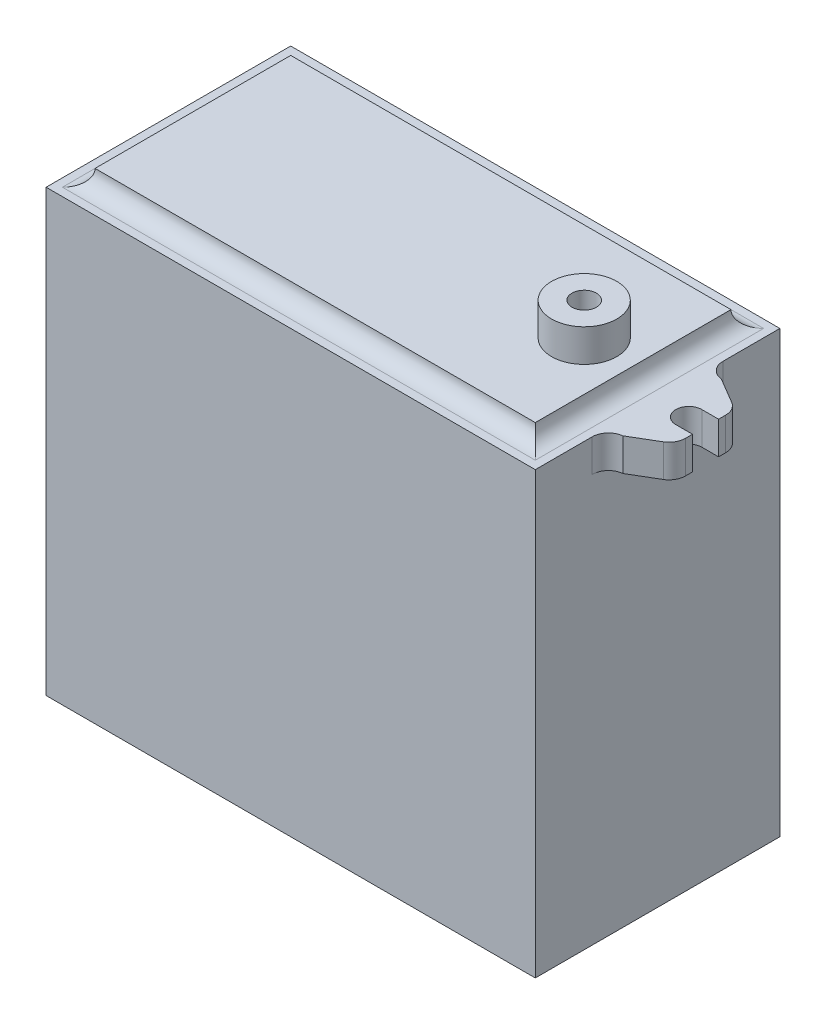
ISO-10303-21;
HEADER;
FILE_DESCRIPTION(('STEP AP214'),'2;1');
FILE_NAME('part.step','',(''),(''),'','','');
FILE_SCHEMA(('AUTOMOTIVE_DESIGN { 1 0 10303 214 1 1 1 1 }'));
ENDSEC;
DATA;
#1=APPLICATION_CONTEXT('core data for automotive mechanical design processes');
#2=APPLICATION_PROTOCOL_DEFINITION('international standard','automotive_design',2000,#1);
#3=PRODUCT_CONTEXT('',#1,'mechanical');
#4=PRODUCT('Part','Part','',(#3));
#5=PRODUCT_RELATED_PRODUCT_CATEGORY('part','',(#4));
#6=PRODUCT_DEFINITION_FORMATION('','',#4);
#7=PRODUCT_DEFINITION_CONTEXT('part definition',#1,'design');
#8=PRODUCT_DEFINITION('design','',#6,#7);
#9=PRODUCT_DEFINITION_SHAPE('','',#8);
#10=(LENGTH_UNIT() NAMED_UNIT(*) SI_UNIT(.MILLI.,.METRE.));
#11=(NAMED_UNIT(*) PLANE_ANGLE_UNIT() SI_UNIT($,.RADIAN.));
#12=(NAMED_UNIT(*) SI_UNIT($,.STERADIAN.) SOLID_ANGLE_UNIT());
#13=UNCERTAINTY_MEASURE_WITH_UNIT(LENGTH_MEASURE(1.E-05),#10,'distance_accuracy_value','');
#14=(GEOMETRIC_REPRESENTATION_CONTEXT(3) GLOBAL_UNCERTAINTY_ASSIGNED_CONTEXT((#13)) GLOBAL_UNIT_ASSIGNED_CONTEXT((#10,
#11,#12)) REPRESENTATION_CONTEXT('',''));
#15=CARTESIAN_POINT('',(0.,0.,0.));
#16=DIRECTION('',(0.,0.,1.));
#17=DIRECTION('',(1.,0.,0.));
#18=AXIS2_PLACEMENT_3D('',#15,#16,#17);
#19=CARTESIAN_POINT('',(15.,27.,-7.5));
#20=DIRECTION('',(-1.,0.,0.));
#21=DIRECTION('',(0.,0.,1.));
#22=AXIS2_PLACEMENT_3D('',#19,#20,#21);
#23=PLANE('',#22);
#24=DIRECTION('',(0.,0.,1.));
#25=VECTOR('',#24,1.);
#26=CARTESIAN_POINT('',(15.,25.,-3.01771015300978));
#27=LINE('',#26,#25);
#28=CARTESIAN_POINT('',(15.,25.,-4.01165249546109));
#29=VERTEX_POINT('',#28);
#30=CARTESIAN_POINT('',(14.9999999999999,25.,4.01165249546109));
#31=VERTEX_POINT('',#30);
#32=EDGE_CURVE('E48',#29,#31,#27,.T.);
#33=ORIENTED_EDGE('',*,*,#32,.T.);
#34=DIRECTION('',(0.,1.,0.));
#35=VECTOR('',#34,1.);
#36=CARTESIAN_POINT('',(15.,27.,4.01165249546109));
#37=LINE('',#36,#35);
#38=CARTESIAN_POINT('',(15.,27.,4.01165249546109));
#39=VERTEX_POINT('',#38);
#40=EDGE_CURVE('E321',#31,#39,#37,.T.);
#41=ORIENTED_EDGE('',*,*,#40,.T.);
#42=DIRECTION('',(0.,0.,-1.));
#43=VECTOR('',#42,1.);
#44=CARTESIAN_POINT('',(15.,27.,-7.5));
#45=LINE('',#44,#43);
#46=CARTESIAN_POINT('',(15.,27.,7.5));
#47=VERTEX_POINT('',#46);
#48=EDGE_CURVE('E232',#47,#39,#45,.T.);
#49=ORIENTED_EDGE('',*,*,#48,.F.);
#50=DIRECTION('',(0.,-1.,0.));
#51=VECTOR('',#50,1.);
#52=CARTESIAN_POINT('',(15.,27.,7.5));
#53=LINE('',#52,#51);
#54=CARTESIAN_POINT('',(15.,0.,7.5));
#55=VERTEX_POINT('',#54);
#56=EDGE_CURVE('E284',#47,#55,#53,.T.);
#57=ORIENTED_EDGE('',*,*,#56,.T.);
#58=DIRECTION('',(0.,0.,-1.));
#59=VECTOR('',#58,1.);
#60=CARTESIAN_POINT('',(15.,0.,-7.5));
#61=LINE('',#60,#59);
#62=CARTESIAN_POINT('',(15.,0.,-7.5));
#63=VERTEX_POINT('',#62);
#64=EDGE_CURVE('E221',#55,#63,#61,.T.);
#65=ORIENTED_EDGE('',*,*,#64,.T.);
#66=DIRECTION('',(0.,-1.,0.));
#67=VECTOR('',#66,1.);
#68=CARTESIAN_POINT('',(15.,27.,-7.5));
#69=LINE('',#68,#67);
#70=CARTESIAN_POINT('',(15.,27.,-7.5));
#71=VERTEX_POINT('',#70);
#72=EDGE_CURVE('E273',#71,#63,#69,.T.);
#73=ORIENTED_EDGE('',*,*,#72,.F.);
#74=CARTESIAN_POINT('',(15.,27.,-4.01165249546109));
#75=VERTEX_POINT('',#74);
#76=EDGE_CURVE('E228',#75,#71,#45,.T.);
#77=ORIENTED_EDGE('',*,*,#76,.F.);
#78=DIRECTION('',(0.,-1.,0.));
#79=VECTOR('',#78,1.);
#80=CARTESIAN_POINT('',(15.,27.,-4.01165249546109));
#81=LINE('',#80,#79);
#82=EDGE_CURVE('E324',#75,#29,#81,.T.);
#83=ORIENTED_EDGE('',*,*,#82,.T.);
#84=EDGE_LOOP('',(#33,#41,#49,#57,#65,#73,#77,#83));
#85=FACE_BOUND('',#84,.T.);
#86=ADVANCED_FACE('F33',(#85),#23,.F.);
#87=CARTESIAN_POINT('',(0.,28.,0.));
#88=DIRECTION('',(0.,1.,0.));
#89=DIRECTION('',(0.,0.,1.));
#90=AXIS2_PLACEMENT_3D('',#87,#88,#89);
#91=PLANE('',#90);
#92=DIRECTION('',(0.,0.,-1.));
#93=VECTOR('',#92,1.);
#94=CARTESIAN_POINT('',(13.5,28.,-6.));
#95=LINE('',#94,#93);
#96=CARTESIAN_POINT('',(13.5,28.,6.));
#97=VERTEX_POINT('',#96);
#98=CARTESIAN_POINT('',(13.5,28.,-6.));
#99=VERTEX_POINT('',#98);
#100=EDGE_CURVE('E211',#97,#99,#95,.T.);
#101=ORIENTED_EDGE('',*,*,#100,.T.);
#102=DIRECTION('',(-1.,0.,0.));
#103=VECTOR('',#102,1.);
#104=CARTESIAN_POINT('',(-13.5,28.,-6.));
#105=LINE('',#104,#103);
#106=CARTESIAN_POINT('',(-13.5,28.,-6.));
#107=VERTEX_POINT('',#106);
#108=EDGE_CURVE('E213',#99,#107,#105,.T.);
#109=ORIENTED_EDGE('',*,*,#108,.T.);
#110=DIRECTION('',(0.,0.,1.));
#111=VECTOR('',#110,1.);
#112=CARTESIAN_POINT('',(-13.5,28.,-6.));
#113=LINE('',#112,#111);
#114=CARTESIAN_POINT('',(-13.5,28.,6.));
#115=VERTEX_POINT('',#114);
#116=EDGE_CURVE('E216',#107,#115,#113,.T.);
#117=ORIENTED_EDGE('',*,*,#116,.T.);
#118=DIRECTION('',(1.,0.,0.));
#119=VECTOR('',#118,1.);
#120=CARTESIAN_POINT('',(-13.5,28.,6.));
#121=LINE('',#120,#119);
#122=EDGE_CURVE('E218',#115,#97,#121,.T.);
#123=ORIENTED_EDGE('',*,*,#122,.T.);
#124=EDGE_LOOP('',(#101,#109,#117,#123));
#125=FACE_BOUND('',#124,.T.);
#126=CARTESIAN_POINT('',(10.5,28.,0.));
#127=DIRECTION('',(0.,1.,0.));
#128=DIRECTION('',(0.,0.,1.));
#129=AXIS2_PLACEMENT_3D('',#126,#127,#128);
#130=CIRCLE('',#129,2.);
#131=CARTESIAN_POINT('',(10.5,28.,2.));
#132=VERTEX_POINT('',#131);
#133=EDGE_CURVE('E203',#132,#132,#130,.T.);
#134=ORIENTED_EDGE('',*,*,#133,.F.);
#135=EDGE_LOOP('',(#134));
#136=FACE_BOUND('',#135,.T.);
#137=ADVANCED_FACE('F411',(#125,#136),#91,.T.);
#138=CARTESIAN_POINT('',(0.,27.,0.));
#139=DIRECTION('',(0.,1.,0.));
#140=DIRECTION('',(0.,0.,1.));
#141=AXIS2_PLACEMENT_3D('',#138,#139,#140);
#142=PLANE('',#141);
#143=DIRECTION('',(0.,0.,-1.));
#144=VECTOR('',#143,1.);
#145=CARTESIAN_POINT('',(14.5,27.,0.));
#146=LINE('',#145,#144);
#147=CARTESIAN_POINT('',(14.5,27.,-7.));
#148=VERTEX_POINT('',#147);
#149=CARTESIAN_POINT('',(14.5,27.,7.));
#150=VERTEX_POINT('',#149);
#151=EDGE_CURVE('E245',#148,#150,#146,.F.);
#152=ORIENTED_EDGE('',*,*,#151,.T.);
#153=DIRECTION('',(1.,0.,0.));
#154=VECTOR('',#153,1.);
#155=CARTESIAN_POINT('',(0.,27.,7.));
#156=LINE('',#155,#154);
#157=CARTESIAN_POINT('',(-14.5,27.,7.));
#158=VERTEX_POINT('',#157);
#159=EDGE_CURVE('E239',#150,#158,#156,.F.);
#160=ORIENTED_EDGE('',*,*,#159,.T.);
#161=DIRECTION('',(0.,0.,1.));
#162=VECTOR('',#161,1.);
#163=CARTESIAN_POINT('',(-14.5,27.,0.));
#164=LINE('',#163,#162);
#165=CARTESIAN_POINT('',(-14.5,27.,-7.));
#166=VERTEX_POINT('',#165);
#167=EDGE_CURVE('E249',#158,#166,#164,.F.);
#168=ORIENTED_EDGE('',*,*,#167,.T.);
#169=DIRECTION('',(-1.,0.,0.));
#170=VECTOR('',#169,1.);
#171=CARTESIAN_POINT('',(0.,27.,-7.));
#172=LINE('',#171,#170);
#173=EDGE_CURVE('E272',#166,#148,#172,.F.);
#174=ORIENTED_EDGE('',*,*,#173,.T.);
#175=EDGE_LOOP('',(#152,#160,#168,#174));
#176=FACE_BOUND('',#175,.T.);
#177=DIRECTION('',(0.,0.,1.));
#178=VECTOR('',#177,1.);
#179=CARTESIAN_POINT('',(17.9395784857372,27.,-1.80665304458195));
#180=LINE('',#179,#178);
#181=CARTESIAN_POINT('',(17.9395784857371,27.,-1.23602283192898));
#182=VERTEX_POINT('',#181);
#183=CARTESIAN_POINT('',(17.9395784857371,27.,-0.8));
#184=VERTEX_POINT('',#183);
#185=EDGE_CURVE('E188',#182,#184,#180,.T.);
#186=ORIENTED_EDGE('',*,*,#185,.F.);
#187=CARTESIAN_POINT('',(16.9395784857371,27.,-1.23602283192904));
#188=DIRECTION('',(0.,1.,0.));
#189=DIRECTION('',(0.,0.,1.));
#190=AXIS2_PLACEMENT_3D('',#187,#188,#189);
#191=CIRCLE('',#190,1.);
#192=CARTESIAN_POINT('',(17.4483077978636,27.,-2.09694936014346));
#193=VERTEX_POINT('',#192);
#194=EDGE_CURVE('E243',#182,#193,#191,.T.);
#195=ORIENTED_EDGE('',*,*,#194,.T.);
#196=DIRECTION('',(0.860926528214423,0.,0.508729312126459));
#197=VECTOR('',#196,1.);
#198=CARTESIAN_POINT('',(15.8900972253198,27.,-3.01771015300978));
#199=LINE('',#198,#197);
#200=CARTESIAN_POINT('',(15.8900972253198,27.,-3.01771015300978));
#201=VERTEX_POINT('',#200);
#202=EDGE_CURVE('E334',#201,#193,#199,.T.);
#203=ORIENTED_EDGE('',*,*,#202,.F.);
#204=CARTESIAN_POINT('',(16.,27.,-4.0116524954611));
#205=DIRECTION('',(0.,1.,0.));
#206=DIRECTION('',(0.,0.,1.));
#207=AXIS2_PLACEMENT_3D('',#204,#205,#206);
#208=CIRCLE('',#207,1.);
#209=EDGE_CURVE('E41',#201,#75,#208,.F.);
#210=ORIENTED_EDGE('',*,*,#209,.T.);
#211=ORIENTED_EDGE('',*,*,#76,.T.);
#212=DIRECTION('',(-1.,0.,0.));
#213=VECTOR('',#212,1.);
#214=CARTESIAN_POINT('',(-15.,27.,-7.5));
#215=LINE('',#214,#213);
#216=CARTESIAN_POINT('',(-15.,27.,-7.5));
#217=VERTEX_POINT('',#216);
#218=EDGE_CURVE('E224',#71,#217,#215,.T.);
#219=ORIENTED_EDGE('',*,*,#218,.T.);
#220=DIRECTION('',(0.,0.,1.));
#221=VECTOR('',#220,1.);
#222=CARTESIAN_POINT('',(-15.,27.,-7.5));
#223=LINE('',#222,#221);
#224=CARTESIAN_POINT('',(-15.,27.,7.5));
#225=VERTEX_POINT('',#224);
#226=EDGE_CURVE('E296',#217,#225,#223,.T.);
#227=ORIENTED_EDGE('',*,*,#226,.T.);
#228=DIRECTION('',(1.,0.,0.));
#229=VECTOR('',#228,1.);
#230=CARTESIAN_POINT('',(-15.,27.,7.5));
#231=LINE('',#230,#229);
#232=EDGE_CURVE('E287',#225,#47,#231,.T.);
#233=ORIENTED_EDGE('',*,*,#232,.T.);
#234=ORIENTED_EDGE('',*,*,#48,.T.);
#235=CARTESIAN_POINT('',(16.,27.,4.01165249546109));
#236=DIRECTION('',(0.,1.,0.));
#237=DIRECTION('',(0.,0.,1.));
#238=AXIS2_PLACEMENT_3D('',#235,#236,#237);
#239=CIRCLE('',#238,1.);
#240=CARTESIAN_POINT('',(15.8900972253198,27.,3.01771015300978));
#241=VERTEX_POINT('',#240);
#242=EDGE_CURVE('E317',#39,#241,#239,.F.);
#243=ORIENTED_EDGE('',*,*,#242,.T.);
#244=DIRECTION('',(0.860926528214423,0.,-0.508729312126459));
#245=VECTOR('',#244,1.);
#246=CARTESIAN_POINT('',(15.8900972253198,27.,3.01771015300978));
#247=LINE('',#246,#245);
#248=CARTESIAN_POINT('',(17.4483077978636,27.,2.09694936014344));
#249=VERTEX_POINT('',#248);
#250=EDGE_CURVE('E363',#241,#249,#247,.T.);
#251=ORIENTED_EDGE('',*,*,#250,.T.);
#252=CARTESIAN_POINT('',(16.9395784857371,27.,1.23602283192902));
#253=DIRECTION('',(0.,1.,0.));
#254=DIRECTION('',(0.,0.,1.));
#255=AXIS2_PLACEMENT_3D('',#252,#253,#254);
#256=CIRCLE('',#255,1.);
#257=CARTESIAN_POINT('',(17.9395784857371,27.,1.23602283192902));
#258=VERTEX_POINT('',#257);
#259=EDGE_CURVE('E238',#249,#258,#256,.T.);
#260=ORIENTED_EDGE('',*,*,#259,.T.);
#261=DIRECTION('',(0.,0.,-1.));
#262=VECTOR('',#261,1.);
#263=CARTESIAN_POINT('',(17.9395784857371,27.,1.80665304458195));
#264=LINE('',#263,#262);
#265=CARTESIAN_POINT('',(17.9395784857371,27.,0.8));
#266=VERTEX_POINT('',#265);
#267=EDGE_CURVE('E361',#258,#266,#264,.T.);
#268=ORIENTED_EDGE('',*,*,#267,.T.);
#269=DIRECTION('',(-1.,0.,0.));
#270=VECTOR('',#269,1.);
#271=CARTESIAN_POINT('',(17.9395784857371,27.,0.8));
#272=LINE('',#271,#270);
#273=CARTESIAN_POINT('',(16.9148378555285,27.,0.8));
#274=VERTEX_POINT('',#273);
#275=EDGE_CURVE('E358',#266,#274,#272,.T.);
#276=ORIENTED_EDGE('',*,*,#275,.T.);
#277=CARTESIAN_POINT('',(16.9148378555285,27.,0.));
#278=DIRECTION('',(0.,1.,0.));
#279=DIRECTION('',(0.,0.,1.));
#280=AXIS2_PLACEMENT_3D('',#277,#278,#279);
#281=CIRCLE('',#280,0.8);
#282=CARTESIAN_POINT('',(16.9148378555285,27.,-0.8));
#283=VERTEX_POINT('',#282);
#284=EDGE_CURVE('E356',#283,#274,#281,.T.);
#285=ORIENTED_EDGE('',*,*,#284,.F.);
#286=DIRECTION('',(-1.,0.,0.));
#287=VECTOR('',#286,1.);
#288=CARTESIAN_POINT('',(17.9395784857371,27.,-0.8));
#289=LINE('',#288,#287);
#290=EDGE_CURVE('E192',#184,#283,#289,.T.);
#291=ORIENTED_EDGE('',*,*,#290,.F.);
#292=EDGE_LOOP('',(#186,#195,#203,#210,#211,#219,#227,#233,#234,#243,#251,#260,#268,#276,#285,#291));
#293=FACE_BOUND('',#292,.T.);
#294=ADVANCED_FACE('F302',(#176,#293),#142,.T.);
#295=CARTESIAN_POINT('',(-15.,27.,-7.5));
#296=DIRECTION('',(0.,0.,1.));
#297=DIRECTION('',(1.,0.,0.));
#298=AXIS2_PLACEMENT_3D('',#295,#296,#297);
#299=PLANE('',#298);
#300=DIRECTION('',(-1.,0.,0.));
#301=VECTOR('',#300,1.);
#302=CARTESIAN_POINT('',(-15.,0.,-7.5));
#303=LINE('',#302,#301);
#304=CARTESIAN_POINT('',(-15.,0.,-7.5));
#305=VERTEX_POINT('',#304);
#306=EDGE_CURVE('E292',#63,#305,#303,.T.);
#307=ORIENTED_EDGE('',*,*,#306,.T.);
#308=DIRECTION('',(0.,-1.,0.));
#309=VECTOR('',#308,1.);
#310=CARTESIAN_POINT('',(-15.,27.,-7.5));
#311=LINE('',#310,#309);
#312=EDGE_CURVE('E276',#217,#305,#311,.T.);
#313=ORIENTED_EDGE('',*,*,#312,.F.);
#314=ORIENTED_EDGE('',*,*,#218,.F.);
#315=ORIENTED_EDGE('',*,*,#72,.T.);
#316=EDGE_LOOP('',(#307,#313,#314,#315));
#317=FACE_BOUND('',#316,.T.);
#318=ADVANCED_FACE('F306',(#317),#299,.F.);
#319=CARTESIAN_POINT('',(-15.,27.,-7.5));
#320=DIRECTION('',(1.,0.,0.));
#321=DIRECTION('',(0.,0.,-1.));
#322=AXIS2_PLACEMENT_3D('',#319,#320,#321);
#323=PLANE('',#322);
#324=DIRECTION('',(0.,0.,1.));
#325=VECTOR('',#324,1.);
#326=CARTESIAN_POINT('',(-15.,0.,-7.5));
#327=LINE('',#326,#325);
#328=CARTESIAN_POINT('',(-15.,0.,7.5));
#329=VERTEX_POINT('',#328);
#330=EDGE_CURVE('E290',#305,#329,#327,.T.);
#331=ORIENTED_EDGE('',*,*,#330,.T.);
#332=DIRECTION('',(0.,-1.,0.));
#333=VECTOR('',#332,1.);
#334=CARTESIAN_POINT('',(-15.,27.,7.5));
#335=LINE('',#334,#333);
#336=EDGE_CURVE('E281',#225,#329,#335,.T.);
#337=ORIENTED_EDGE('',*,*,#336,.F.);
#338=ORIENTED_EDGE('',*,*,#226,.F.);
#339=ORIENTED_EDGE('',*,*,#312,.T.);
#340=EDGE_LOOP('',(#331,#337,#338,#339));
#341=FACE_BOUND('',#340,.T.);
#342=ADVANCED_FACE('F309',(#341),#323,.F.);
#343=CARTESIAN_POINT('',(-15.,27.,7.5));
#344=DIRECTION('',(0.,0.,-1.));
#345=DIRECTION('',(-1.,0.,0.));
#346=AXIS2_PLACEMENT_3D('',#343,#344,#345);
#347=PLANE('',#346);
#348=DIRECTION('',(1.,0.,0.));
#349=VECTOR('',#348,1.);
#350=CARTESIAN_POINT('',(-15.,0.,7.5));
#351=LINE('',#350,#349);
#352=EDGE_CURVE('E288',#329,#55,#351,.T.);
#353=ORIENTED_EDGE('',*,*,#352,.T.);
#354=ORIENTED_EDGE('',*,*,#56,.F.);
#355=ORIENTED_EDGE('',*,*,#232,.F.);
#356=ORIENTED_EDGE('',*,*,#336,.T.);
#357=EDGE_LOOP('',(#353,#354,#355,#356));
#358=FACE_BOUND('',#357,.T.);
#359=ADVANCED_FACE('F314',(#358),#347,.F.);
#360=CARTESIAN_POINT('',(0.,0.,0.));
#361=DIRECTION('',(0.,1.,0.));
#362=DIRECTION('',(0.,0.,1.));
#363=AXIS2_PLACEMENT_3D('',#360,#361,#362);
#364=PLANE('',#363);
#365=ORIENTED_EDGE('',*,*,#64,.F.);
#366=ORIENTED_EDGE('',*,*,#352,.F.);
#367=ORIENTED_EDGE('',*,*,#330,.F.);
#368=ORIENTED_EDGE('',*,*,#306,.F.);
#369=EDGE_LOOP('',(#365,#366,#367,#368));
#370=FACE_BOUND('',#369,.T.);
#371=ADVANCED_FACE('F433',(#370),#364,.F.);
#372=CARTESIAN_POINT('',(-13.5,28.,-7.));
#373=DIRECTION('',(-1.,0.,0.));
#374=DIRECTION('',(0.,0.,1.));
#375=AXIS2_PLACEMENT_3D('',#372,#373,#374);
#376=CYLINDRICAL_SURFACE('',#375,1.);
#377=CARTESIAN_POINT('',(14.5,28.,-7.));
#378=DIRECTION('',(-0.707106781186547,0.,-0.707106781186547));
#379=DIRECTION('',(-0.707106781186547,0.,0.707106781186547));
#380=AXIS2_PLACEMENT_3D('',#377,#378,#379);
#381=ELLIPSE('',#380,1.41421356237309,1.);
#382=EDGE_CURVE('E255',#148,#99,#381,.T.);
#383=ORIENTED_EDGE('',*,*,#382,.F.);
#384=ORIENTED_EDGE('',*,*,#173,.F.);
#385=CARTESIAN_POINT('',(-14.5,28.,-7.));
#386=DIRECTION('',(-0.707106781186547,0.,0.707106781186547));
#387=DIRECTION('',(-0.707106781186547,0.,-0.707106781186547));
#388=AXIS2_PLACEMENT_3D('',#385,#386,#387);
#389=ELLIPSE('',#388,1.41421356237309,1.);
#390=EDGE_CURVE('E214',#107,#166,#389,.F.);
#391=ORIENTED_EDGE('',*,*,#390,.F.);
#392=ORIENTED_EDGE('',*,*,#108,.F.);
#393=EDGE_LOOP('',(#383,#384,#391,#392));
#394=FACE_BOUND('',#393,.T.);
#395=ADVANCED_FACE('F271',(#394),#376,.F.);
#396=CARTESIAN_POINT('',(-14.5,28.,-6.));
#397=DIRECTION('',(0.,0.,1.));
#398=DIRECTION('',(1.,0.,0.));
#399=AXIS2_PLACEMENT_3D('',#396,#397,#398);
#400=CYLINDRICAL_SURFACE('',#399,1.);
#401=ORIENTED_EDGE('',*,*,#390,.T.);
#402=ORIENTED_EDGE('',*,*,#167,.F.);
#403=CARTESIAN_POINT('',(-14.5,28.,7.));
#404=DIRECTION('',(0.707106781186547,0.,0.707106781186547));
#405=DIRECTION('',(-0.707106781186547,0.,0.707106781186547));
#406=AXIS2_PLACEMENT_3D('',#403,#404,#405);
#407=ELLIPSE('',#406,1.41421356237309,1.);
#408=EDGE_CURVE('E254',#115,#158,#407,.F.);
#409=ORIENTED_EDGE('',*,*,#408,.F.);
#410=ORIENTED_EDGE('',*,*,#116,.F.);
#411=EDGE_LOOP('',(#401,#402,#409,#410));
#412=FACE_BOUND('',#411,.T.);
#413=ADVANCED_FACE('F266',(#412),#400,.F.);
#414=CARTESIAN_POINT('',(14.5,28.,-6.));
#415=DIRECTION('',(0.,0.,-1.));
#416=DIRECTION('',(-1.,0.,0.));
#417=AXIS2_PLACEMENT_3D('',#414,#415,#416);
#418=CYLINDRICAL_SURFACE('',#417,1.);
#419=ORIENTED_EDGE('',*,*,#382,.T.);
#420=ORIENTED_EDGE('',*,*,#100,.F.);
#421=CARTESIAN_POINT('',(14.5,28.,7.));
#422=DIRECTION('',(0.707106781186547,0.,-0.707106781186547));
#423=DIRECTION('',(-0.707106781186547,0.,-0.707106781186547));
#424=AXIS2_PLACEMENT_3D('',#421,#422,#423);
#425=ELLIPSE('',#424,1.41421356237309,1.);
#426=EDGE_CURVE('E208',#150,#97,#425,.T.);
#427=ORIENTED_EDGE('',*,*,#426,.F.);
#428=ORIENTED_EDGE('',*,*,#151,.F.);
#429=EDGE_LOOP('',(#419,#420,#427,#428));
#430=FACE_BOUND('',#429,.T.);
#431=ADVANCED_FACE('F425',(#430),#418,.F.);
#432=CARTESIAN_POINT('',(-13.5,28.,7.));
#433=DIRECTION('',(1.,0.,0.));
#434=DIRECTION('',(0.,0.,-1.));
#435=AXIS2_PLACEMENT_3D('',#432,#433,#434);
#436=CYLINDRICAL_SURFACE('',#435,1.);
#437=ORIENTED_EDGE('',*,*,#408,.T.);
#438=ORIENTED_EDGE('',*,*,#159,.F.);
#439=ORIENTED_EDGE('',*,*,#426,.T.);
#440=ORIENTED_EDGE('',*,*,#122,.F.);
#441=EDGE_LOOP('',(#437,#438,#439,#440));
#442=FACE_BOUND('',#441,.T.);
#443=ADVANCED_FACE('F421',(#442),#436,.F.);
#444=CARTESIAN_POINT('',(10.5,30.,0.));
#445=DIRECTION('',(0.,-1.,0.));
#446=DIRECTION('',(0.,0.,-1.));
#447=AXIS2_PLACEMENT_3D('',#444,#445,#446);
#448=CYLINDRICAL_SURFACE('',#447,2.);
#449=CARTESIAN_POINT('',(10.5,30.,0.));
#450=DIRECTION('',(0.,1.,0.));
#451=DIRECTION('',(0.,0.,1.));
#452=AXIS2_PLACEMENT_3D('',#449,#450,#451);
#453=CIRCLE('',#452,2.);
#454=CARTESIAN_POINT('',(10.5,30.,2.));
#455=VERTEX_POINT('',#454);
#456=EDGE_CURVE('E205',#455,#455,#453,.T.);
#457=ORIENTED_EDGE('',*,*,#456,.F.);
#458=EDGE_LOOP('',(#457));
#459=FACE_BOUND('',#458,.T.);
#460=ORIENTED_EDGE('',*,*,#133,.T.);
#461=EDGE_LOOP('',(#460));
#462=FACE_BOUND('',#461,.T.);
#463=ADVANCED_FACE('F424',(#459,#462),#448,.T.);
#464=CARTESIAN_POINT('',(10.5,30.,0.));
#465=DIRECTION('',(0.,1.,0.));
#466=DIRECTION('',(0.,0.,1.));
#467=AXIS2_PLACEMENT_3D('',#464,#465,#466);
#468=PLANE('',#467);
#469=CARTESIAN_POINT('',(10.5,30.,0.));
#470=DIRECTION('',(0.,1.,0.));
#471=DIRECTION('',(0.,0.,1.));
#472=AXIS2_PLACEMENT_3D('',#469,#470,#471);
#473=CIRCLE('',#472,0.75);
#474=CARTESIAN_POINT('',(10.5,30.,0.75));
#475=VERTEX_POINT('',#474);
#476=EDGE_CURVE('E193',#475,#475,#473,.T.);
#477=ORIENTED_EDGE('',*,*,#476,.F.);
#478=EDGE_LOOP('',(#477));
#479=FACE_BOUND('',#478,.T.);
#480=ORIENTED_EDGE('',*,*,#456,.T.);
#481=EDGE_LOOP('',(#480));
#482=FACE_BOUND('',#481,.T.);
#483=ADVANCED_FACE('F552',(#479,#482),#468,.T.);
#484=CARTESIAN_POINT('',(10.5,28.,0.));
#485=DIRECTION('',(0.,1.,0.));
#486=DIRECTION('',(0.,0.,1.));
#487=AXIS2_PLACEMENT_3D('',#484,#485,#486);
#488=CYLINDRICAL_SURFACE('',#487,0.75);
#489=CARTESIAN_POINT('',(10.5,28.,0.));
#490=DIRECTION('',(0.,1.,0.));
#491=DIRECTION('',(0.,0.,1.));
#492=AXIS2_PLACEMENT_3D('',#489,#490,#491);
#493=CIRCLE('',#492,0.75);
#494=CARTESIAN_POINT('',(10.5,28.,0.75));
#495=VERTEX_POINT('',#494);
#496=EDGE_CURVE('E196',#495,#495,#493,.T.);
#497=ORIENTED_EDGE('',*,*,#496,.F.);
#498=EDGE_LOOP('',(#497));
#499=FACE_BOUND('',#498,.T.);
#500=ORIENTED_EDGE('',*,*,#476,.T.);
#501=EDGE_LOOP('',(#500));
#502=FACE_BOUND('',#501,.T.);
#503=ADVANCED_FACE('F542',(#499,#502),#488,.F.);
#504=CARTESIAN_POINT('',(10.5,28.,0.));
#505=DIRECTION('',(0.,1.,0.));
#506=DIRECTION('',(0.,0.,1.));
#507=AXIS2_PLACEMENT_3D('',#504,#505,#506);
#508=PLANE('',#507);
#509=ORIENTED_EDGE('',*,*,#496,.T.);
#510=EDGE_LOOP('',(#509));
#511=FACE_BOUND('',#510,.T.);
#512=ADVANCED_FACE('F534',(#511),#508,.T.);
#513=CARTESIAN_POINT('',(17.9395784857371,25.,-0.8));
#514=DIRECTION('',(0.,0.,-1.));
#515=DIRECTION('',(-1.,0.,0.));
#516=AXIS2_PLACEMENT_3D('',#513,#514,#515);
#517=PLANE('',#516);
#518=ORIENTED_EDGE('',*,*,#290,.T.);
#519=DIRECTION('',(0.,1.,0.));
#520=VECTOR('',#519,1.);
#521=CARTESIAN_POINT('',(16.9148378555285,25.,-0.8));
#522=LINE('',#521,#520);
#523=CARTESIAN_POINT('',(16.9148378555285,25.,-0.8));
#524=VERTEX_POINT('',#523);
#525=EDGE_CURVE('E172',#524,#283,#522,.T.);
#526=ORIENTED_EDGE('',*,*,#525,.F.);
#527=DIRECTION('',(-1.,0.,0.));
#528=VECTOR('',#527,1.);
#529=CARTESIAN_POINT('',(17.9395784857371,25.,-0.8));
#530=LINE('',#529,#528);
#531=CARTESIAN_POINT('',(17.9395784857371,25.,-0.8));
#532=VERTEX_POINT('',#531);
#533=EDGE_CURVE('E178',#532,#524,#530,.T.);
#534=ORIENTED_EDGE('',*,*,#533,.F.);
#535=DIRECTION('',(0.,1.,0.));
#536=VECTOR('',#535,1.);
#537=CARTESIAN_POINT('',(17.9395784857371,25.,-0.8));
#538=LINE('',#537,#536);
#539=EDGE_CURVE('E349',#532,#184,#538,.T.);
#540=ORIENTED_EDGE('',*,*,#539,.T.);
#541=EDGE_LOOP('',(#518,#526,#534,#540));
#542=FACE_BOUND('',#541,.T.);
#543=ADVANCED_FACE('F190',(#542),#517,.F.);
#544=CARTESIAN_POINT('',(16.9148378555285,25.,0.));
#545=DIRECTION('',(0.,1.,0.));
#546=DIRECTION('',(0.,0.,1.));
#547=AXIS2_PLACEMENT_3D('',#544,#545,#546);
#548=CYLINDRICAL_SURFACE('',#547,0.8);
#549=ORIENTED_EDGE('',*,*,#284,.T.);
#550=DIRECTION('',(0.,1.,0.));
#551=VECTOR('',#550,1.);
#552=CARTESIAN_POINT('',(16.9148378555285,25.,0.8));
#553=LINE('',#552,#551);
#554=CARTESIAN_POINT('',(16.9148378555285,25.,0.8));
#555=VERTEX_POINT('',#554);
#556=EDGE_CURVE('E174',#555,#274,#553,.T.);
#557=ORIENTED_EDGE('',*,*,#556,.F.);
#558=CARTESIAN_POINT('',(16.9148378555285,25.,0.));
#559=DIRECTION('',(0.,1.,0.));
#560=DIRECTION('',(0.,0.,1.));
#561=AXIS2_PLACEMENT_3D('',#558,#559,#560);
#562=CIRCLE('',#561,0.8);
#563=EDGE_CURVE('E167',#524,#555,#562,.T.);
#564=ORIENTED_EDGE('',*,*,#563,.F.);
#565=ORIENTED_EDGE('',*,*,#525,.T.);
#566=EDGE_LOOP('',(#549,#557,#564,#565));
#567=FACE_BOUND('',#566,.T.);
#568=ADVANCED_FACE('F170',(#567),#548,.F.);
#569=CARTESIAN_POINT('',(17.9395784857371,25.,0.8));
#570=DIRECTION('',(0.,0.,-1.));
#571=DIRECTION('',(-1.,0.,0.));
#572=AXIS2_PLACEMENT_3D('',#569,#570,#571);
#573=PLANE('',#572);
#574=ORIENTED_EDGE('',*,*,#275,.F.);
#575=DIRECTION('',(0.,1.,0.));
#576=VECTOR('',#575,1.);
#577=CARTESIAN_POINT('',(17.9395784857371,25.,0.8));
#578=LINE('',#577,#576);
#579=CARTESIAN_POINT('',(17.9395784857371,25.,0.8));
#580=VERTEX_POINT('',#579);
#581=EDGE_CURVE('E198',#580,#266,#578,.T.);
#582=ORIENTED_EDGE('',*,*,#581,.F.);
#583=DIRECTION('',(-1.,0.,0.));
#584=VECTOR('',#583,1.);
#585=CARTESIAN_POINT('',(17.9395784857371,25.,0.8));
#586=LINE('',#585,#584);
#587=EDGE_CURVE('E177',#580,#555,#586,.T.);
#588=ORIENTED_EDGE('',*,*,#587,.T.);
#589=ORIENTED_EDGE('',*,*,#556,.T.);
#590=EDGE_LOOP('',(#574,#582,#588,#589));
#591=FACE_BOUND('',#590,.T.);
#592=ADVANCED_FACE('F381',(#591),#573,.T.);
#593=CARTESIAN_POINT('',(17.9395784857371,25.,1.80665304458195));
#594=DIRECTION('',(1.,0.,0.));
#595=DIRECTION('',(0.,0.,-1.));
#596=AXIS2_PLACEMENT_3D('',#593,#594,#595);
#597=PLANE('',#596);
#598=ORIENTED_EDGE('',*,*,#267,.F.);
#599=DIRECTION('',(0.,1.,0.));
#600=VECTOR('',#599,1.);
#601=CARTESIAN_POINT('',(17.9395784857371,25.,1.23602283192902));
#602=LINE('',#601,#600);
#603=CARTESIAN_POINT('',(17.9395784857371,25.,1.23602283192902));
#604=VERTEX_POINT('',#603);
#605=EDGE_CURVE('E328',#258,#604,#602,.F.);
#606=ORIENTED_EDGE('',*,*,#605,.T.);
#607=DIRECTION('',(0.,0.,-1.));
#608=VECTOR('',#607,1.);
#609=CARTESIAN_POINT('',(17.9395784857371,25.,1.80665304458195));
#610=LINE('',#609,#608);
#611=EDGE_CURVE('E379',#604,#580,#610,.T.);
#612=ORIENTED_EDGE('',*,*,#611,.T.);
#613=ORIENTED_EDGE('',*,*,#581,.T.);
#614=EDGE_LOOP('',(#598,#606,#612,#613));
#615=FACE_BOUND('',#614,.T.);
#616=ADVANCED_FACE('F376',(#615),#597,.T.);
#617=CARTESIAN_POINT('',(15.8900972253198,25.,3.01771015300978));
#618=DIRECTION('',(0.508729312126459,0.,0.860926528214423));
#619=DIRECTION('',(0.860926528214423,0.,-0.508729312126459));
#620=AXIS2_PLACEMENT_3D('',#617,#618,#619);
#621=PLANE('',#620);
#622=DIRECTION('',(0.860926528214423,0.,-0.508729312126459));
#623=VECTOR('',#622,1.);
#624=CARTESIAN_POINT('',(15.8900972253198,25.,3.01771015300978));
#625=LINE('',#624,#623);
#626=CARTESIAN_POINT('',(15.8900972253198,25.,3.01771015300978));
#627=VERTEX_POINT('',#626);
#628=CARTESIAN_POINT('',(17.4483077978636,25.,2.09694936014344));
#629=VERTEX_POINT('',#628);
#630=EDGE_CURVE('E351',#627,#629,#625,.T.);
#631=ORIENTED_EDGE('',*,*,#630,.T.);
#632=DIRECTION('',(0.,1.,0.));
#633=VECTOR('',#632,1.);
#634=CARTESIAN_POINT('',(17.4483077978636,25.,2.09694936014344));
#635=LINE('',#634,#633);
#636=EDGE_CURVE('E387',#629,#249,#635,.T.);
#637=ORIENTED_EDGE('',*,*,#636,.T.);
#638=ORIENTED_EDGE('',*,*,#250,.F.);
#639=DIRECTION('',(0.,1.,0.));
#640=VECTOR('',#639,1.);
#641=CARTESIAN_POINT('',(15.8900972253198,25.,3.01771015300978));
#642=LINE('',#641,#640);
#643=EDGE_CURVE('E369',#627,#241,#642,.T.);
#644=ORIENTED_EDGE('',*,*,#643,.F.);
#645=EDGE_LOOP('',(#631,#637,#638,#644));
#646=FACE_BOUND('',#645,.T.);
#647=ADVANCED_FACE('F390',(#646),#621,.T.);
#648=CARTESIAN_POINT('',(15.8900972253198,25.,-3.01771015300978));
#649=DIRECTION('',(-0.508729312126459,0.,0.860926528214423));
#650=DIRECTION('',(0.860926528214423,0.,0.508729312126459));
#651=AXIS2_PLACEMENT_3D('',#648,#649,#650);
#652=PLANE('',#651);
#653=ORIENTED_EDGE('',*,*,#202,.T.);
#654=DIRECTION('',(0.,1.,0.));
#655=VECTOR('',#654,1.);
#656=CARTESIAN_POINT('',(17.4483077978636,25.,-2.09694936014346));
#657=LINE('',#656,#655);
#658=CARTESIAN_POINT('',(17.4483077978636,25.,-2.09694936014346));
#659=VERTEX_POINT('',#658);
#660=EDGE_CURVE('E347',#193,#659,#657,.F.);
#661=ORIENTED_EDGE('',*,*,#660,.T.);
#662=DIRECTION('',(0.860926528214423,0.,0.508729312126459));
#663=VECTOR('',#662,1.);
#664=CARTESIAN_POINT('',(15.8900972253198,25.,-3.01771015300978));
#665=LINE('',#664,#663);
#666=CARTESIAN_POINT('',(15.8900972253198,25.,-3.01771015300978));
#667=VERTEX_POINT('',#666);
#668=EDGE_CURVE('E342',#667,#659,#665,.T.);
#669=ORIENTED_EDGE('',*,*,#668,.F.);
#670=DIRECTION('',(0.,1.,0.));
#671=VECTOR('',#670,1.);
#672=CARTESIAN_POINT('',(15.8900972253198,25.,-3.01771015300978));
#673=LINE('',#672,#671);
#674=EDGE_CURVE('E340',#667,#201,#673,.T.);
#675=ORIENTED_EDGE('',*,*,#674,.T.);
#676=EDGE_LOOP('',(#653,#661,#669,#675));
#677=FACE_BOUND('',#676,.T.);
#678=ADVANCED_FACE('F345',(#677),#652,.F.);
#679=CARTESIAN_POINT('',(17.9395784857372,25.,-1.80665304458195));
#680=DIRECTION('',(-1.,0.,0.));
#681=DIRECTION('',(0.,0.,1.));
#682=AXIS2_PLACEMENT_3D('',#679,#680,#681);
#683=PLANE('',#682);
#684=DIRECTION('',(0.,0.,1.));
#685=VECTOR('',#684,1.);
#686=CARTESIAN_POINT('',(17.9395784857372,25.,-1.80665304458195));
#687=LINE('',#686,#685);
#688=CARTESIAN_POINT('',(17.9395784857371,25.,-1.23602283192898));
#689=VERTEX_POINT('',#688);
#690=EDGE_CURVE('E184',#689,#532,#687,.T.);
#691=ORIENTED_EDGE('',*,*,#690,.F.);
#692=DIRECTION('',(0.,1.,0.));
#693=VECTOR('',#692,1.);
#694=CARTESIAN_POINT('',(17.9395784857371,25.,-1.23602283192898));
#695=LINE('',#694,#693);
#696=EDGE_CURVE('E236',#689,#182,#695,.T.);
#697=ORIENTED_EDGE('',*,*,#696,.T.);
#698=ORIENTED_EDGE('',*,*,#185,.T.);
#699=ORIENTED_EDGE('',*,*,#539,.F.);
#700=EDGE_LOOP('',(#691,#697,#698,#699));
#701=FACE_BOUND('',#700,.T.);
#702=ADVANCED_FACE('F401',(#701),#683,.F.);
#703=CARTESIAN_POINT('',(16.9148378555285,25.,0.));
#704=DIRECTION('',(0.,1.,0.));
#705=DIRECTION('',(0.,0.,1.));
#706=AXIS2_PLACEMENT_3D('',#703,#704,#705);
#707=PLANE('',#706);
#708=ORIENTED_EDGE('',*,*,#668,.T.);
#709=CARTESIAN_POINT('',(16.9395784857371,25.,-1.23602283192904));
#710=DIRECTION('',(0.,1.,0.));
#711=DIRECTION('',(0.,0.,1.));
#712=AXIS2_PLACEMENT_3D('',#709,#710,#711);
#713=CIRCLE('',#712,1.);
#714=EDGE_CURVE('E392',#659,#689,#713,.F.);
#715=ORIENTED_EDGE('',*,*,#714,.T.);
#716=ORIENTED_EDGE('',*,*,#690,.T.);
#717=ORIENTED_EDGE('',*,*,#533,.T.);
#718=ORIENTED_EDGE('',*,*,#563,.T.);
#719=ORIENTED_EDGE('',*,*,#587,.F.);
#720=ORIENTED_EDGE('',*,*,#611,.F.);
#721=CARTESIAN_POINT('',(16.9395784857371,25.,1.23602283192902));
#722=DIRECTION('',(0.,1.,0.));
#723=DIRECTION('',(0.,0.,1.));
#724=AXIS2_PLACEMENT_3D('',#721,#722,#723);
#725=CIRCLE('',#724,1.);
#726=EDGE_CURVE('E394',#604,#629,#725,.F.);
#727=ORIENTED_EDGE('',*,*,#726,.T.);
#728=ORIENTED_EDGE('',*,*,#630,.F.);
#729=CARTESIAN_POINT('',(16.,25.,4.01165249546109));
#730=DIRECTION('',(0.,1.,0.));
#731=DIRECTION('',(0.,0.,1.));
#732=AXIS2_PLACEMENT_3D('',#729,#730,#731);
#733=CIRCLE('',#732,1.);
#734=EDGE_CURVE('E326',#627,#31,#733,.T.);
#735=ORIENTED_EDGE('',*,*,#734,.T.);
#736=ORIENTED_EDGE('',*,*,#32,.F.);
#737=CARTESIAN_POINT('',(16.,25.,-4.0116524954611));
#738=DIRECTION('',(0.,1.,0.));
#739=DIRECTION('',(0.,0.,1.));
#740=AXIS2_PLACEMENT_3D('',#737,#738,#739);
#741=CIRCLE('',#740,1.);
#742=EDGE_CURVE('E11',#29,#667,#741,.T.);
#743=ORIENTED_EDGE('',*,*,#742,.T.);
#744=EDGE_LOOP('',(#708,#715,#716,#717,#718,#719,#720,#727,#728,#735,#736,#743));
#745=FACE_BOUND('',#744,.T.);
#746=ADVANCED_FACE('F182',(#745),#707,.F.);
#747=CARTESIAN_POINT('',(16.9395784857371,25.,-1.23602283192904));
#748=DIRECTION('',(0.,1.,0.));
#749=DIRECTION('',(0.,0.,1.));
#750=AXIS2_PLACEMENT_3D('',#747,#748,#749);
#751=CYLINDRICAL_SURFACE('',#750,1.);
#752=ORIENTED_EDGE('',*,*,#714,.F.);
#753=ORIENTED_EDGE('',*,*,#660,.F.);
#754=ORIENTED_EDGE('',*,*,#194,.F.);
#755=ORIENTED_EDGE('',*,*,#696,.F.);
#756=EDGE_LOOP('',(#752,#753,#754,#755));
#757=FACE_BOUND('',#756,.T.);
#758=ADVANCED_FACE('F400',(#757),#751,.T.);
#759=CARTESIAN_POINT('',(16.9395784857371,25.,1.23602283192902));
#760=DIRECTION('',(0.,1.,0.));
#761=DIRECTION('',(0.,0.,1.));
#762=AXIS2_PLACEMENT_3D('',#759,#760,#761);
#763=CYLINDRICAL_SURFACE('',#762,1.);
#764=ORIENTED_EDGE('',*,*,#726,.F.);
#765=ORIENTED_EDGE('',*,*,#605,.F.);
#766=ORIENTED_EDGE('',*,*,#259,.F.);
#767=ORIENTED_EDGE('',*,*,#636,.F.);
#768=EDGE_LOOP('',(#764,#765,#766,#767));
#769=FACE_BOUND('',#768,.T.);
#770=ADVANCED_FACE('F386',(#769),#763,.T.);
#771=CARTESIAN_POINT('',(16.,25.,4.01165249546109));
#772=DIRECTION('',(0.,1.,0.));
#773=DIRECTION('',(0.,0.,1.));
#774=AXIS2_PLACEMENT_3D('',#771,#772,#773);
#775=CYLINDRICAL_SURFACE('',#774,1.);
#776=ORIENTED_EDGE('',*,*,#734,.F.);
#777=ORIENTED_EDGE('',*,*,#643,.T.);
#778=ORIENTED_EDGE('',*,*,#242,.F.);
#779=ORIENTED_EDGE('',*,*,#40,.F.);
#780=EDGE_LOOP('',(#776,#777,#778,#779));
#781=FACE_BOUND('',#780,.T.);
#782=ADVANCED_FACE('F437',(#781),#775,.F.);
#783=CARTESIAN_POINT('',(16.,25.,-4.0116524954611));
#784=DIRECTION('',(0.,-1.,0.));
#785=DIRECTION('',(0.,0.,-1.));
#786=AXIS2_PLACEMENT_3D('',#783,#784,#785);
#787=CYLINDRICAL_SURFACE('',#786,1.);
#788=ORIENTED_EDGE('',*,*,#742,.F.);
#789=ORIENTED_EDGE('',*,*,#82,.F.);
#790=ORIENTED_EDGE('',*,*,#209,.F.);
#791=ORIENTED_EDGE('',*,*,#674,.F.);
#792=EDGE_LOOP('',(#788,#789,#790,#791));
#793=FACE_BOUND('',#792,.T.);
#794=ADVANCED_FACE('F35',(#793),#787,.F.);
#795=CLOSED_SHELL('',(#86,#137,#294,#318,#342,#359,#371,#395,#413,#431,#443,#463,#483,#503,#512,
#543,#568,#592,#616,#647,#678,#702,#746,#758,#770,#782,#794));
#796=MANIFOLD_SOLID_BREP('B2',#795);
#797=ADVANCED_BREP_SHAPE_REPRESENTATION('',(#18,#796),#14);
#798=SHAPE_DEFINITION_REPRESENTATION(#9,#797);
ENDSEC;
END-ISO-10303-21;
